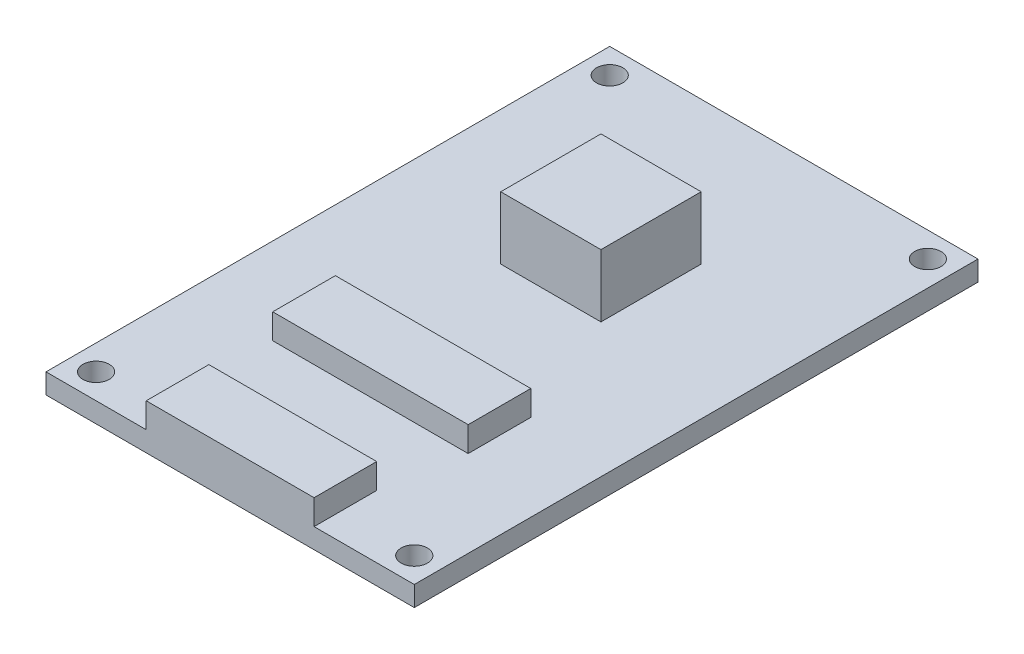
ISO-10303-21;
HEADER;
FILE_DESCRIPTION(('STEP AP214'),'2;1');
FILE_NAME('part.step','',(''),(''),'','','');
FILE_SCHEMA(('AUTOMOTIVE_DESIGN { 1 0 10303 214 1 1 1 1 }'));
ENDSEC;
DATA;
#1=APPLICATION_CONTEXT('core data for automotive mechanical design processes');
#2=APPLICATION_PROTOCOL_DEFINITION('international standard','automotive_design',2000,#1);
#3=PRODUCT_CONTEXT('',#1,'mechanical');
#4=PRODUCT('Part','Part','',(#3));
#5=PRODUCT_RELATED_PRODUCT_CATEGORY('part','',(#4));
#6=PRODUCT_DEFINITION_FORMATION('','',#4);
#7=PRODUCT_DEFINITION_CONTEXT('part definition',#1,'design');
#8=PRODUCT_DEFINITION('design','',#6,#7);
#9=PRODUCT_DEFINITION_SHAPE('','',#8);
#10=(LENGTH_UNIT() NAMED_UNIT(*) SI_UNIT(.MILLI.,.METRE.));
#11=(NAMED_UNIT(*) PLANE_ANGLE_UNIT() SI_UNIT($,.RADIAN.));
#12=(NAMED_UNIT(*) SI_UNIT($,.STERADIAN.) SOLID_ANGLE_UNIT());
#13=UNCERTAINTY_MEASURE_WITH_UNIT(LENGTH_MEASURE(1.E-05),#10,'distance_accuracy_value','');
#14=(GEOMETRIC_REPRESENTATION_CONTEXT(3) GLOBAL_UNCERTAINTY_ASSIGNED_CONTEXT((#13)) GLOBAL_UNIT_ASSIGNED_CONTEXT((#10,
#11,#12)) REPRESENTATION_CONTEXT('',''));
#15=CARTESIAN_POINT('',(0.,0.,0.));
#16=DIRECTION('',(0.,0.,1.));
#17=DIRECTION('',(1.,0.,0.));
#18=AXIS2_PLACEMENT_3D('',#15,#16,#17);
#19=CARTESIAN_POINT('',(0.,1.6,0.));
#20=DIRECTION('',(0.,-1.,0.));
#21=DIRECTION('',(0.,0.,-1.));
#22=AXIS2_PLACEMENT_3D('',#19,#20,#21);
#23=PLANE('',#22);
#24=DIRECTION('',(0.,0.,1.));
#25=VECTOR('',#24,1.);
#26=CARTESIAN_POINT('',(6.9,1.6,-11.2));
#27=LINE('',#26,#25);
#28=CARTESIAN_POINT('',(6.9,1.6,-16.2));
#29=VERTEX_POINT('',#28);
#30=CARTESIAN_POINT('',(6.9,1.6,-11.2));
#31=VERTEX_POINT('',#30);
#32=EDGE_CURVE('E248',#29,#31,#27,.T.);
#33=ORIENTED_EDGE('',*,*,#32,.F.);
#34=DIRECTION('',(-1.,0.,0.));
#35=VECTOR('',#34,1.);
#36=CARTESIAN_POINT('',(6.9,1.6,-16.2));
#37=LINE('',#36,#35);
#38=CARTESIAN_POINT('',(22.5,1.6,-16.2));
#39=VERTEX_POINT('',#38);
#40=EDGE_CURVE('E254',#39,#29,#37,.T.);
#41=ORIENTED_EDGE('',*,*,#40,.F.);
#42=DIRECTION('',(0.,0.,-1.));
#43=VECTOR('',#42,1.);
#44=CARTESIAN_POINT('',(22.5,1.6,-11.2));
#45=LINE('',#44,#43);
#46=CARTESIAN_POINT('',(22.5,1.6,-11.2));
#47=VERTEX_POINT('',#46);
#48=EDGE_CURVE('E271',#47,#39,#45,.T.);
#49=ORIENTED_EDGE('',*,*,#48,.F.);
#50=DIRECTION('',(1.,0.,0.));
#51=VECTOR('',#50,1.);
#52=CARTESIAN_POINT('',(6.9,1.6,-11.2));
#53=LINE('',#52,#51);
#54=EDGE_CURVE('E267',#31,#47,#53,.T.);
#55=ORIENTED_EDGE('',*,*,#54,.F.);
#56=EDGE_LOOP('',(#33,#41,#49,#55));
#57=FACE_BOUND('',#56,.T.);
#58=CARTESIAN_POINT('',(27.4,1.6,-2.));
#59=DIRECTION('',(0.,1.,0.));
#60=DIRECTION('',(0.,0.,1.));
#61=AXIS2_PLACEMENT_3D('',#58,#59,#60);
#62=CIRCLE('',#61,1.05);
#63=CARTESIAN_POINT('',(27.4,1.6,-0.950000000000006));
#64=VERTEX_POINT('',#63);
#65=EDGE_CURVE('E335',#64,#64,#62,.T.);
#66=ORIENTED_EDGE('',*,*,#65,.F.);
#67=EDGE_LOOP('',(#66));
#68=FACE_BOUND('',#67,.T.);
#69=CARTESIAN_POINT('',(2.00000000000001,1.6,-2.));
#70=DIRECTION('',(0.,1.,0.));
#71=DIRECTION('',(0.,0.,1.));
#72=AXIS2_PLACEMENT_3D('',#69,#70,#71);
#73=CIRCLE('',#72,1.05);
#74=CARTESIAN_POINT('',(2.00000000000001,1.6,-0.950000000000002));
#75=VERTEX_POINT('',#74);
#76=EDGE_CURVE('E343',#75,#75,#73,.T.);
#77=ORIENTED_EDGE('',*,*,#76,.F.);
#78=EDGE_LOOP('',(#77));
#79=FACE_BOUND('',#78,.T.);
#80=CARTESIAN_POINT('',(27.4,1.6,-43.));
#81=DIRECTION('',(0.,1.,0.));
#82=DIRECTION('',(0.,0.,1.));
#83=AXIS2_PLACEMENT_3D('',#80,#81,#82);
#84=CIRCLE('',#83,1.05);
#85=CARTESIAN_POINT('',(27.4,1.6,-41.95));
#86=VERTEX_POINT('',#85);
#87=EDGE_CURVE('E351',#86,#86,#84,.T.);
#88=ORIENTED_EDGE('',*,*,#87,.F.);
#89=EDGE_LOOP('',(#88));
#90=FACE_BOUND('',#89,.T.);
#91=CARTESIAN_POINT('',(2.,1.6,-43.));
#92=DIRECTION('',(0.,1.,0.));
#93=DIRECTION('',(0.,0.,1.));
#94=AXIS2_PLACEMENT_3D('',#91,#92,#93);
#95=CIRCLE('',#94,1.05);
#96=CARTESIAN_POINT('',(2.,1.6,-41.95));
#97=VERTEX_POINT('',#96);
#98=EDGE_CURVE('E359',#97,#97,#95,.T.);
#99=ORIENTED_EDGE('',*,*,#98,.F.);
#100=EDGE_LOOP('',(#99));
#101=FACE_BOUND('',#100,.T.);
#102=DIRECTION('',(0.,0.,1.));
#103=VECTOR('',#102,1.);
#104=CARTESIAN_POINT('',(8.,1.6,0.));
#105=LINE('',#104,#103);
#106=CARTESIAN_POINT('',(8.,1.6,-5.));
#107=VERTEX_POINT('',#106);
#108=CARTESIAN_POINT('',(8.,1.6,0.));
#109=VERTEX_POINT('',#108);
#110=EDGE_CURVE('E293',#107,#109,#105,.T.);
#111=ORIENTED_EDGE('',*,*,#110,.F.);
#112=DIRECTION('',(-1.,0.,0.));
#113=VECTOR('',#112,1.);
#114=CARTESIAN_POINT('',(8.,1.6,-5.));
#115=LINE('',#114,#113);
#116=CARTESIAN_POINT('',(21.4,1.6,-5.));
#117=VERTEX_POINT('',#116);
#118=EDGE_CURVE('E299',#117,#107,#115,.T.);
#119=ORIENTED_EDGE('',*,*,#118,.F.);
#120=DIRECTION('',(0.,0.,-1.));
#121=VECTOR('',#120,1.);
#122=CARTESIAN_POINT('',(21.4,1.6,0.));
#123=LINE('',#122,#121);
#124=CARTESIAN_POINT('',(21.4,1.6,0.));
#125=VERTEX_POINT('',#124);
#126=EDGE_CURVE('E312',#125,#117,#123,.T.);
#127=ORIENTED_EDGE('',*,*,#126,.F.);
#128=DIRECTION('',(1.,0.,0.));
#129=VECTOR('',#128,1.);
#130=CARTESIAN_POINT('',(0.,1.6,0.));
#131=LINE('',#130,#129);
#132=CARTESIAN_POINT('',(29.4,1.6,0.));
#133=VERTEX_POINT('',#132);
#134=EDGE_CURVE('E371',#125,#133,#131,.T.);
#135=ORIENTED_EDGE('',*,*,#134,.T.);
#136=DIRECTION('',(0.,0.,-1.));
#137=VECTOR('',#136,1.);
#138=CARTESIAN_POINT('',(29.4,1.6,0.));
#139=LINE('',#138,#137);
#140=CARTESIAN_POINT('',(29.4,1.6,-45.));
#141=VERTEX_POINT('',#140);
#142=EDGE_CURVE('E376',#133,#141,#139,.T.);
#143=ORIENTED_EDGE('',*,*,#142,.T.);
#144=DIRECTION('',(-1.,0.,0.));
#145=VECTOR('',#144,1.);
#146=CARTESIAN_POINT('',(0.,1.6,-45.));
#147=LINE('',#146,#145);
#148=CARTESIAN_POINT('',(0.,1.6,-45.));
#149=VERTEX_POINT('',#148);
#150=EDGE_CURVE('E379',#141,#149,#147,.T.);
#151=ORIENTED_EDGE('',*,*,#150,.T.);
#152=DIRECTION('',(0.,0.,1.));
#153=VECTOR('',#152,1.);
#154=CARTESIAN_POINT('',(0.,1.6,0.));
#155=LINE('',#154,#153);
#156=CARTESIAN_POINT('',(0.,1.6,0.));
#157=VERTEX_POINT('',#156);
#158=EDGE_CURVE('E367',#149,#157,#155,.T.);
#159=ORIENTED_EDGE('',*,*,#158,.T.);
#160=EDGE_CURVE('E373',#157,#109,#131,.T.);
#161=ORIENTED_EDGE('',*,*,#160,.T.);
#162=EDGE_LOOP('',(#111,#119,#127,#135,#143,#151,#159,#161));
#163=FACE_BOUND('',#162,.T.);
#164=DIRECTION('',(0.,0.,1.));
#165=VECTOR('',#164,1.);
#166=CARTESIAN_POINT('',(10.7,1.6,-33.6));
#167=LINE('',#166,#165);
#168=CARTESIAN_POINT('',(10.7,1.6,-33.6));
#169=VERTEX_POINT('',#168);
#170=CARTESIAN_POINT('',(10.7,1.6,-25.6));
#171=VERTEX_POINT('',#170);
#172=EDGE_CURVE('E199',#169,#171,#167,.T.);
#173=ORIENTED_EDGE('',*,*,#172,.F.);
#174=DIRECTION('',(-1.,0.,0.));
#175=VECTOR('',#174,1.);
#176=CARTESIAN_POINT('',(10.7,1.6,-33.6));
#177=LINE('',#176,#175);
#178=CARTESIAN_POINT('',(18.7,1.6,-33.6));
#179=VERTEX_POINT('',#178);
#180=EDGE_CURVE('E196',#179,#169,#177,.T.);
#181=ORIENTED_EDGE('',*,*,#180,.F.);
#182=DIRECTION('',(0.,0.,-1.));
#183=VECTOR('',#182,1.);
#184=CARTESIAN_POINT('',(18.7,1.6,-33.6));
#185=LINE('',#184,#183);
#186=CARTESIAN_POINT('',(18.7,1.6,-25.6));
#187=VERTEX_POINT('',#186);
#188=EDGE_CURVE('E60',#187,#179,#185,.T.);
#189=ORIENTED_EDGE('',*,*,#188,.F.);
#190=DIRECTION('',(1.,0.,0.));
#191=VECTOR('',#190,1.);
#192=CARTESIAN_POINT('',(10.7,1.6,-25.6));
#193=LINE('',#192,#191);
#194=EDGE_CURVE('E55',#171,#187,#193,.T.);
#195=ORIENTED_EDGE('',*,*,#194,.F.);
#196=EDGE_LOOP('',(#173,#181,#189,#195));
#197=FACE_BOUND('',#196,.T.);
#198=ADVANCED_FACE('F39',(#57,#68,#79,#90,#101,#163,#197),#23,.F.);
#199=CARTESIAN_POINT('',(0.,0.,0.));
#200=DIRECTION('',(0.,-1.,0.));
#201=DIRECTION('',(0.,0.,-1.));
#202=AXIS2_PLACEMENT_3D('',#199,#200,#201);
#203=PLANE('',#202);
#204=CARTESIAN_POINT('',(2.00000000000001,0.,-2.));
#205=DIRECTION('',(0.,1.,0.));
#206=DIRECTION('',(0.,0.,1.));
#207=AXIS2_PLACEMENT_3D('',#204,#205,#206);
#208=CIRCLE('',#207,1.05);
#209=CARTESIAN_POINT('',(2.00000000000001,0.,-0.950000000000002));
#210=VERTEX_POINT('',#209);
#211=EDGE_CURVE('E339',#210,#210,#208,.T.);
#212=ORIENTED_EDGE('',*,*,#211,.T.);
#213=EDGE_LOOP('',(#212));
#214=FACE_BOUND('',#213,.T.);
#215=CARTESIAN_POINT('',(2.,0.,-43.));
#216=DIRECTION('',(0.,1.,0.));
#217=DIRECTION('',(0.,0.,1.));
#218=AXIS2_PLACEMENT_3D('',#215,#216,#217);
#219=CIRCLE('',#218,1.05);
#220=CARTESIAN_POINT('',(2.,0.,-41.95));
#221=VERTEX_POINT('',#220);
#222=EDGE_CURVE('E355',#221,#221,#219,.T.);
#223=ORIENTED_EDGE('',*,*,#222,.T.);
#224=EDGE_LOOP('',(#223));
#225=FACE_BOUND('',#224,.T.);
#226=DIRECTION('',(0.,0.,1.));
#227=VECTOR('',#226,1.);
#228=CARTESIAN_POINT('',(0.,0.,0.));
#229=LINE('',#228,#227);
#230=CARTESIAN_POINT('',(0.,0.,-45.));
#231=VERTEX_POINT('',#230);
#232=CARTESIAN_POINT('',(0.,0.,0.));
#233=VERTEX_POINT('',#232);
#234=EDGE_CURVE('E363',#231,#233,#229,.T.);
#235=ORIENTED_EDGE('',*,*,#234,.F.);
#236=DIRECTION('',(-1.,0.,0.));
#237=VECTOR('',#236,1.);
#238=CARTESIAN_POINT('',(0.,0.,-45.));
#239=LINE('',#238,#237);
#240=CARTESIAN_POINT('',(29.4,0.,-45.));
#241=VERTEX_POINT('',#240);
#242=EDGE_CURVE('E372',#241,#231,#239,.T.);
#243=ORIENTED_EDGE('',*,*,#242,.F.);
#244=DIRECTION('',(0.,0.,-1.));
#245=VECTOR('',#244,1.);
#246=CARTESIAN_POINT('',(29.4,0.,0.));
#247=LINE('',#246,#245);
#248=CARTESIAN_POINT('',(29.4,0.,0.));
#249=VERTEX_POINT('',#248);
#250=EDGE_CURVE('E389',#249,#241,#247,.T.);
#251=ORIENTED_EDGE('',*,*,#250,.F.);
#252=DIRECTION('',(1.,0.,0.));
#253=VECTOR('',#252,1.);
#254=CARTESIAN_POINT('',(0.,0.,0.));
#255=LINE('',#254,#253);
#256=EDGE_CURVE('E386',#233,#249,#255,.T.);
#257=ORIENTED_EDGE('',*,*,#256,.F.);
#258=EDGE_LOOP('',(#235,#243,#251,#257));
#259=FACE_BOUND('',#258,.T.);
#260=CARTESIAN_POINT('',(27.4,0.,-43.));
#261=DIRECTION('',(0.,1.,0.));
#262=DIRECTION('',(0.,0.,1.));
#263=AXIS2_PLACEMENT_3D('',#260,#261,#262);
#264=CIRCLE('',#263,1.05);
#265=CARTESIAN_POINT('',(27.4,0.,-41.95));
#266=VERTEX_POINT('',#265);
#267=EDGE_CURVE('E347',#266,#266,#264,.T.);
#268=ORIENTED_EDGE('',*,*,#267,.T.);
#269=EDGE_LOOP('',(#268));
#270=FACE_BOUND('',#269,.T.);
#271=CARTESIAN_POINT('',(27.4,0.,-2.));
#272=DIRECTION('',(0.,1.,0.));
#273=DIRECTION('',(0.,0.,1.));
#274=AXIS2_PLACEMENT_3D('',#271,#272,#273);
#275=CIRCLE('',#274,1.05);
#276=CARTESIAN_POINT('',(27.4,0.,-0.950000000000006));
#277=VERTEX_POINT('',#276);
#278=EDGE_CURVE('E334',#277,#277,#275,.T.);
#279=ORIENTED_EDGE('',*,*,#278,.T.);
#280=EDGE_LOOP('',(#279));
#281=FACE_BOUND('',#280,.T.);
#282=DIRECTION('',(1.,0.,0.));
#283=VECTOR('',#282,1.);
#284=CARTESIAN_POINT('',(7.4,0.,-6.3));
#285=LINE('',#284,#283);
#286=CARTESIAN_POINT('',(7.4,0.,-6.3));
#287=VERTEX_POINT('',#286);
#288=CARTESIAN_POINT('',(22.1,0.,-6.3));
#289=VERTEX_POINT('',#288);
#290=EDGE_CURVE('E206',#287,#289,#285,.T.);
#291=ORIENTED_EDGE('',*,*,#290,.F.);
#292=DIRECTION('',(0.,0.,-1.));
#293=VECTOR('',#292,1.);
#294=CARTESIAN_POINT('',(7.4,0.,-2.3));
#295=LINE('',#294,#293);
#296=CARTESIAN_POINT('',(7.4,0.,-2.3));
#297=VERTEX_POINT('',#296);
#298=EDGE_CURVE('E201',#297,#287,#295,.T.);
#299=ORIENTED_EDGE('',*,*,#298,.F.);
#300=DIRECTION('',(-1.,0.,0.));
#301=VECTOR('',#300,1.);
#302=CARTESIAN_POINT('',(7.4,0.,-2.3));
#303=LINE('',#302,#301);
#304=CARTESIAN_POINT('',(22.1,0.,-2.3));
#305=VERTEX_POINT('',#304);
#306=EDGE_CURVE('E217',#305,#297,#303,.T.);
#307=ORIENTED_EDGE('',*,*,#306,.F.);
#308=DIRECTION('',(0.,0.,1.));
#309=VECTOR('',#308,1.);
#310=CARTESIAN_POINT('',(22.1,0.,-2.3));
#311=LINE('',#310,#309);
#312=EDGE_CURVE('E229',#289,#305,#311,.T.);
#313=ORIENTED_EDGE('',*,*,#312,.F.);
#314=EDGE_LOOP('',(#291,#299,#307,#313));
#315=FACE_BOUND('',#314,.T.);
#316=ADVANCED_FACE('F413',(#214,#225,#259,#270,#281,#315),#203,.T.);
#317=CARTESIAN_POINT('',(0.,1.6,0.));
#318=DIRECTION('',(1.,0.,0.));
#319=DIRECTION('',(0.,0.,-1.));
#320=AXIS2_PLACEMENT_3D('',#317,#318,#319);
#321=PLANE('',#320);
#322=ORIENTED_EDGE('',*,*,#234,.T.);
#323=DIRECTION('',(0.,-1.,0.));
#324=VECTOR('',#323,1.);
#325=CARTESIAN_POINT('',(0.,1.6,0.));
#326=LINE('',#325,#324);
#327=EDGE_CURVE('E11',#157,#233,#326,.T.);
#328=ORIENTED_EDGE('',*,*,#327,.F.);
#329=ORIENTED_EDGE('',*,*,#158,.F.);
#330=DIRECTION('',(0.,-1.,0.));
#331=VECTOR('',#330,1.);
#332=CARTESIAN_POINT('',(0.,1.6,-45.));
#333=LINE('',#332,#331);
#334=EDGE_CURVE('E382',#149,#231,#333,.T.);
#335=ORIENTED_EDGE('',*,*,#334,.T.);
#336=EDGE_LOOP('',(#322,#328,#329,#335));
#337=FACE_BOUND('',#336,.T.);
#338=ADVANCED_FACE('F41',(#337),#321,.F.);
#339=CARTESIAN_POINT('',(0.,1.6,0.));
#340=DIRECTION('',(0.,0.,-1.));
#341=DIRECTION('',(-1.,0.,0.));
#342=AXIS2_PLACEMENT_3D('',#339,#340,#341);
#343=PLANE('',#342);
#344=ORIENTED_EDGE('',*,*,#256,.T.);
#345=DIRECTION('',(0.,-1.,0.));
#346=VECTOR('',#345,1.);
#347=CARTESIAN_POINT('',(29.4,1.6,0.));
#348=LINE('',#347,#346);
#349=EDGE_CURVE('E48',#133,#249,#348,.T.);
#350=ORIENTED_EDGE('',*,*,#349,.F.);
#351=ORIENTED_EDGE('',*,*,#134,.F.);
#352=DIRECTION('',(0.,-1.,0.));
#353=VECTOR('',#352,1.);
#354=CARTESIAN_POINT('',(21.4,3.6,0.));
#355=LINE('',#354,#353);
#356=CARTESIAN_POINT('',(21.4,3.6,0.));
#357=VERTEX_POINT('',#356);
#358=EDGE_CURVE('E326',#357,#125,#355,.T.);
#359=ORIENTED_EDGE('',*,*,#358,.F.);
#360=DIRECTION('',(1.,0.,0.));
#361=VECTOR('',#360,1.);
#362=CARTESIAN_POINT('',(8.,3.6,0.));
#363=LINE('',#362,#361);
#364=CARTESIAN_POINT('',(8.,3.6,0.));
#365=VERTEX_POINT('',#364);
#366=EDGE_CURVE('E298',#365,#357,#363,.T.);
#367=ORIENTED_EDGE('',*,*,#366,.F.);
#368=DIRECTION('',(0.,-1.,0.));
#369=VECTOR('',#368,1.);
#370=CARTESIAN_POINT('',(8.,3.6,0.));
#371=LINE('',#370,#369);
#372=EDGE_CURVE('E330',#365,#109,#371,.T.);
#373=ORIENTED_EDGE('',*,*,#372,.T.);
#374=ORIENTED_EDGE('',*,*,#160,.F.);
#375=ORIENTED_EDGE('',*,*,#327,.T.);
#376=EDGE_LOOP('',(#344,#350,#351,#359,#367,#373,#374,#375));
#377=FACE_BOUND('',#376,.T.);
#378=ADVANCED_FACE('F425',(#377),#343,.F.);
#379=CARTESIAN_POINT('',(29.4,1.6,0.));
#380=DIRECTION('',(-1.,0.,0.));
#381=DIRECTION('',(0.,0.,1.));
#382=AXIS2_PLACEMENT_3D('',#379,#380,#381);
#383=PLANE('',#382);
#384=ORIENTED_EDGE('',*,*,#250,.T.);
#385=DIRECTION('',(0.,-1.,0.));
#386=VECTOR('',#385,1.);
#387=CARTESIAN_POINT('',(29.4,1.6,-45.));
#388=LINE('',#387,#386);
#389=EDGE_CURVE('E397',#141,#241,#388,.T.);
#390=ORIENTED_EDGE('',*,*,#389,.F.);
#391=ORIENTED_EDGE('',*,*,#142,.F.);
#392=ORIENTED_EDGE('',*,*,#349,.T.);
#393=EDGE_LOOP('',(#384,#390,#391,#392));
#394=FACE_BOUND('',#393,.T.);
#395=ADVANCED_FACE('F406',(#394),#383,.F.);
#396=CARTESIAN_POINT('',(0.,1.6,-45.));
#397=DIRECTION('',(0.,0.,1.));
#398=DIRECTION('',(1.,0.,0.));
#399=AXIS2_PLACEMENT_3D('',#396,#397,#398);
#400=PLANE('',#399);
#401=ORIENTED_EDGE('',*,*,#242,.T.);
#402=ORIENTED_EDGE('',*,*,#334,.F.);
#403=ORIENTED_EDGE('',*,*,#150,.F.);
#404=ORIENTED_EDGE('',*,*,#389,.T.);
#405=EDGE_LOOP('',(#401,#402,#403,#404));
#406=FACE_BOUND('',#405,.T.);
#407=ADVANCED_FACE('F417',(#406),#400,.F.);
#408=CARTESIAN_POINT('',(2.,1.6,-43.));
#409=DIRECTION('',(0.,-1.,0.));
#410=DIRECTION('',(0.,0.,-1.));
#411=AXIS2_PLACEMENT_3D('',#408,#409,#410);
#412=CYLINDRICAL_SURFACE('',#411,1.05);
#413=ORIENTED_EDGE('',*,*,#98,.T.);
#414=EDGE_LOOP('',(#413));
#415=FACE_BOUND('',#414,.T.);
#416=ORIENTED_EDGE('',*,*,#222,.F.);
#417=EDGE_LOOP('',(#416));
#418=FACE_BOUND('',#417,.T.);
#419=ADVANCED_FACE('F459',(#415,#418),#412,.F.);
#420=CARTESIAN_POINT('',(27.4,1.6,-43.));
#421=DIRECTION('',(0.,-1.,0.));
#422=DIRECTION('',(0.,0.,-1.));
#423=AXIS2_PLACEMENT_3D('',#420,#421,#422);
#424=CYLINDRICAL_SURFACE('',#423,1.05);
#425=ORIENTED_EDGE('',*,*,#87,.T.);
#426=EDGE_LOOP('',(#425));
#427=FACE_BOUND('',#426,.T.);
#428=ORIENTED_EDGE('',*,*,#267,.F.);
#429=EDGE_LOOP('',(#428));
#430=FACE_BOUND('',#429,.T.);
#431=ADVANCED_FACE('F680',(#427,#430),#424,.F.);
#432=CARTESIAN_POINT('',(2.00000000000001,1.6,-2.));
#433=DIRECTION('',(0.,-1.,0.));
#434=DIRECTION('',(0.,0.,-1.));
#435=AXIS2_PLACEMENT_3D('',#432,#433,#434);
#436=CYLINDRICAL_SURFACE('',#435,1.05);
#437=ORIENTED_EDGE('',*,*,#76,.T.);
#438=EDGE_LOOP('',(#437));
#439=FACE_BOUND('',#438,.T.);
#440=ORIENTED_EDGE('',*,*,#211,.F.);
#441=EDGE_LOOP('',(#440));
#442=FACE_BOUND('',#441,.T.);
#443=ADVANCED_FACE('F671',(#439,#442),#436,.F.);
#444=CARTESIAN_POINT('',(27.4,1.6,-2.));
#445=DIRECTION('',(0.,-1.,0.));
#446=DIRECTION('',(0.,0.,-1.));
#447=AXIS2_PLACEMENT_3D('',#444,#445,#446);
#448=CYLINDRICAL_SURFACE('',#447,1.05);
#449=ORIENTED_EDGE('',*,*,#65,.T.);
#450=EDGE_LOOP('',(#449));
#451=FACE_BOUND('',#450,.T.);
#452=ORIENTED_EDGE('',*,*,#278,.F.);
#453=EDGE_LOOP('',(#452));
#454=FACE_BOUND('',#453,.T.);
#455=ADVANCED_FACE('F655',(#451,#454),#448,.F.);
#456=CARTESIAN_POINT('',(8.,3.6,0.));
#457=DIRECTION('',(1.,0.,0.));
#458=DIRECTION('',(0.,0.,-1.));
#459=AXIS2_PLACEMENT_3D('',#456,#457,#458);
#460=PLANE('',#459);
#461=ORIENTED_EDGE('',*,*,#110,.T.);
#462=ORIENTED_EDGE('',*,*,#372,.F.);
#463=DIRECTION('',(0.,0.,1.));
#464=VECTOR('',#463,1.);
#465=CARTESIAN_POINT('',(8.,3.6,0.));
#466=LINE('',#465,#464);
#467=CARTESIAN_POINT('',(8.,3.6,-5.));
#468=VERTEX_POINT('',#467);
#469=EDGE_CURVE('E294',#468,#365,#466,.T.);
#470=ORIENTED_EDGE('',*,*,#469,.F.);
#471=DIRECTION('',(0.,-1.,0.));
#472=VECTOR('',#471,1.);
#473=CARTESIAN_POINT('',(8.,3.6,-5.));
#474=LINE('',#473,#472);
#475=EDGE_CURVE('E308',#468,#107,#474,.T.);
#476=ORIENTED_EDGE('',*,*,#475,.T.);
#477=EDGE_LOOP('',(#461,#462,#470,#476));
#478=FACE_BOUND('',#477,.T.);
#479=ADVANCED_FACE('F437',(#478),#460,.F.);
#480=CARTESIAN_POINT('',(21.4,3.6,0.));
#481=DIRECTION('',(-1.,0.,0.));
#482=DIRECTION('',(0.,0.,1.));
#483=AXIS2_PLACEMENT_3D('',#480,#481,#482);
#484=PLANE('',#483);
#485=ORIENTED_EDGE('',*,*,#126,.T.);
#486=DIRECTION('',(0.,-1.,0.));
#487=VECTOR('',#486,1.);
#488=CARTESIAN_POINT('',(21.4,3.6,-5.));
#489=LINE('',#488,#487);
#490=CARTESIAN_POINT('',(21.4,3.6,-5.));
#491=VERTEX_POINT('',#490);
#492=EDGE_CURVE('E322',#491,#117,#489,.T.);
#493=ORIENTED_EDGE('',*,*,#492,.F.);
#494=DIRECTION('',(0.,0.,-1.));
#495=VECTOR('',#494,1.);
#496=CARTESIAN_POINT('',(21.4,3.6,0.));
#497=LINE('',#496,#495);
#498=EDGE_CURVE('E302',#357,#491,#497,.T.);
#499=ORIENTED_EDGE('',*,*,#498,.F.);
#500=ORIENTED_EDGE('',*,*,#358,.T.);
#501=EDGE_LOOP('',(#485,#493,#499,#500));
#502=FACE_BOUND('',#501,.T.);
#503=ADVANCED_FACE('F428',(#502),#484,.F.);
#504=CARTESIAN_POINT('',(8.,3.6,-5.));
#505=DIRECTION('',(0.,0.,1.));
#506=DIRECTION('',(1.,0.,0.));
#507=AXIS2_PLACEMENT_3D('',#504,#505,#506);
#508=PLANE('',#507);
#509=ORIENTED_EDGE('',*,*,#118,.T.);
#510=ORIENTED_EDGE('',*,*,#475,.F.);
#511=DIRECTION('',(-1.,0.,0.));
#512=VECTOR('',#511,1.);
#513=CARTESIAN_POINT('',(8.,3.6,-5.));
#514=LINE('',#513,#512);
#515=EDGE_CURVE('E305',#491,#468,#514,.T.);
#516=ORIENTED_EDGE('',*,*,#515,.F.);
#517=ORIENTED_EDGE('',*,*,#492,.T.);
#518=EDGE_LOOP('',(#509,#510,#516,#517));
#519=FACE_BOUND('',#518,.T.);
#520=ADVANCED_FACE('F439',(#519),#508,.F.);
#521=CARTESIAN_POINT('',(0.,3.6,0.));
#522=DIRECTION('',(0.,-1.,0.));
#523=DIRECTION('',(0.,0.,-1.));
#524=AXIS2_PLACEMENT_3D('',#521,#522,#523);
#525=PLANE('',#524);
#526=ORIENTED_EDGE('',*,*,#469,.T.);
#527=ORIENTED_EDGE('',*,*,#366,.T.);
#528=ORIENTED_EDGE('',*,*,#498,.T.);
#529=ORIENTED_EDGE('',*,*,#515,.T.);
#530=EDGE_LOOP('',(#526,#527,#528,#529));
#531=FACE_BOUND('',#530,.T.);
#532=ADVANCED_FACE('F432',(#531),#525,.F.);
#533=CARTESIAN_POINT('',(6.9,3.6,-11.2));
#534=DIRECTION('',(1.,0.,0.));
#535=DIRECTION('',(0.,0.,-1.));
#536=AXIS2_PLACEMENT_3D('',#533,#534,#535);
#537=PLANE('',#536);
#538=ORIENTED_EDGE('',*,*,#32,.T.);
#539=DIRECTION('',(0.,-1.,0.));
#540=VECTOR('',#539,1.);
#541=CARTESIAN_POINT('',(6.9,3.6,-11.2));
#542=LINE('',#541,#540);
#543=CARTESIAN_POINT('',(6.9,3.6,-11.2));
#544=VERTEX_POINT('',#543);
#545=EDGE_CURVE('E289',#544,#31,#542,.T.);
#546=ORIENTED_EDGE('',*,*,#545,.F.);
#547=DIRECTION('',(0.,0.,1.));
#548=VECTOR('',#547,1.);
#549=CARTESIAN_POINT('',(6.9,3.6,-11.2));
#550=LINE('',#549,#548);
#551=CARTESIAN_POINT('',(6.9,3.6,-16.2));
#552=VERTEX_POINT('',#551);
#553=EDGE_CURVE('E249',#552,#544,#550,.T.);
#554=ORIENTED_EDGE('',*,*,#553,.F.);
#555=DIRECTION('',(0.,-1.,0.));
#556=VECTOR('',#555,1.);
#557=CARTESIAN_POINT('',(6.9,3.6,-16.2));
#558=LINE('',#557,#556);
#559=EDGE_CURVE('E263',#552,#29,#558,.T.);
#560=ORIENTED_EDGE('',*,*,#559,.T.);
#561=EDGE_LOOP('',(#538,#546,#554,#560));
#562=FACE_BOUND('',#561,.T.);
#563=ADVANCED_FACE('F446',(#562),#537,.F.);
#564=CARTESIAN_POINT('',(6.9,3.6,-11.2));
#565=DIRECTION('',(0.,0.,-1.));
#566=DIRECTION('',(-1.,0.,0.));
#567=AXIS2_PLACEMENT_3D('',#564,#565,#566);
#568=PLANE('',#567);
#569=ORIENTED_EDGE('',*,*,#54,.T.);
#570=DIRECTION('',(0.,-1.,0.));
#571=VECTOR('',#570,1.);
#572=CARTESIAN_POINT('',(22.5,3.6,-11.2));
#573=LINE('',#572,#571);
#574=CARTESIAN_POINT('',(22.5,3.6,-11.2));
#575=VERTEX_POINT('',#574);
#576=EDGE_CURVE('E285',#575,#47,#573,.T.);
#577=ORIENTED_EDGE('',*,*,#576,.F.);
#578=DIRECTION('',(1.,0.,0.));
#579=VECTOR('',#578,1.);
#580=CARTESIAN_POINT('',(6.9,3.6,-11.2));
#581=LINE('',#580,#579);
#582=EDGE_CURVE('E253',#544,#575,#581,.T.);
#583=ORIENTED_EDGE('',*,*,#582,.F.);
#584=ORIENTED_EDGE('',*,*,#545,.T.);
#585=EDGE_LOOP('',(#569,#577,#583,#584));
#586=FACE_BOUND('',#585,.T.);
#587=ADVANCED_FACE('F594',(#586),#568,.F.);
#588=CARTESIAN_POINT('',(22.5,3.6,-11.2));
#589=DIRECTION('',(-1.,0.,0.));
#590=DIRECTION('',(0.,0.,1.));
#591=AXIS2_PLACEMENT_3D('',#588,#589,#590);
#592=PLANE('',#591);
#593=ORIENTED_EDGE('',*,*,#48,.T.);
#594=DIRECTION('',(0.,-1.,0.));
#595=VECTOR('',#594,1.);
#596=CARTESIAN_POINT('',(22.5,3.6,-16.2));
#597=LINE('',#596,#595);
#598=CARTESIAN_POINT('',(22.5,3.6,-16.2));
#599=VERTEX_POINT('',#598);
#600=EDGE_CURVE('E281',#599,#39,#597,.T.);
#601=ORIENTED_EDGE('',*,*,#600,.F.);
#602=DIRECTION('',(0.,0.,-1.));
#603=VECTOR('',#602,1.);
#604=CARTESIAN_POINT('',(22.5,3.6,-11.2));
#605=LINE('',#604,#603);
#606=EDGE_CURVE('E257',#575,#599,#605,.T.);
#607=ORIENTED_EDGE('',*,*,#606,.F.);
#608=ORIENTED_EDGE('',*,*,#576,.T.);
#609=EDGE_LOOP('',(#593,#601,#607,#608));
#610=FACE_BOUND('',#609,.T.);
#611=ADVANCED_FACE('F590',(#610),#592,.F.);
#612=CARTESIAN_POINT('',(6.9,3.6,-16.2));
#613=DIRECTION('',(0.,0.,1.));
#614=DIRECTION('',(1.,0.,0.));
#615=AXIS2_PLACEMENT_3D('',#612,#613,#614);
#616=PLANE('',#615);
#617=ORIENTED_EDGE('',*,*,#40,.T.);
#618=ORIENTED_EDGE('',*,*,#559,.F.);
#619=DIRECTION('',(-1.,0.,0.));
#620=VECTOR('',#619,1.);
#621=CARTESIAN_POINT('',(6.9,3.6,-16.2));
#622=LINE('',#621,#620);
#623=EDGE_CURVE('E260',#599,#552,#622,.T.);
#624=ORIENTED_EDGE('',*,*,#623,.F.);
#625=ORIENTED_EDGE('',*,*,#600,.T.);
#626=EDGE_LOOP('',(#617,#618,#624,#625));
#627=FACE_BOUND('',#626,.T.);
#628=ADVANCED_FACE('F586',(#627),#616,.F.);
#629=CARTESIAN_POINT('',(0.,3.6,0.));
#630=DIRECTION('',(0.,-1.,0.));
#631=DIRECTION('',(0.,0.,-1.));
#632=AXIS2_PLACEMENT_3D('',#629,#630,#631);
#633=PLANE('',#632);
#634=ORIENTED_EDGE('',*,*,#553,.T.);
#635=ORIENTED_EDGE('',*,*,#582,.T.);
#636=ORIENTED_EDGE('',*,*,#606,.T.);
#637=ORIENTED_EDGE('',*,*,#623,.T.);
#638=EDGE_LOOP('',(#634,#635,#636,#637));
#639=FACE_BOUND('',#638,.T.);
#640=ADVANCED_FACE('F484',(#639),#633,.F.);
#641=CARTESIAN_POINT('',(7.4,-2.,-2.3));
#642=DIRECTION('',(1.,0.,0.));
#643=DIRECTION('',(0.,0.,-1.));
#644=AXIS2_PLACEMENT_3D('',#641,#642,#643);
#645=PLANE('',#644);
#646=ORIENTED_EDGE('',*,*,#298,.T.);
#647=DIRECTION('',(0.,1.,0.));
#648=VECTOR('',#647,1.);
#649=CARTESIAN_POINT('',(7.4,-2.,-6.3));
#650=LINE('',#649,#648);
#651=CARTESIAN_POINT('',(7.4,-2.,-6.3));
#652=VERTEX_POINT('',#651);
#653=EDGE_CURVE('E245',#652,#287,#650,.T.);
#654=ORIENTED_EDGE('',*,*,#653,.F.);
#655=DIRECTION('',(0.,0.,-1.));
#656=VECTOR('',#655,1.);
#657=CARTESIAN_POINT('',(7.4,-2.,-2.3));
#658=LINE('',#657,#656);
#659=CARTESIAN_POINT('',(7.4,-2.,-2.3));
#660=VERTEX_POINT('',#659);
#661=EDGE_CURVE('E212',#660,#652,#658,.T.);
#662=ORIENTED_EDGE('',*,*,#661,.F.);
#663=DIRECTION('',(0.,1.,0.));
#664=VECTOR('',#663,1.);
#665=CARTESIAN_POINT('',(7.4,-2.,-2.3));
#666=LINE('',#665,#664);
#667=EDGE_CURVE('E225',#660,#297,#666,.T.);
#668=ORIENTED_EDGE('',*,*,#667,.T.);
#669=EDGE_LOOP('',(#646,#654,#662,#668));
#670=FACE_BOUND('',#669,.T.);
#671=ADVANCED_FACE('F488',(#670),#645,.F.);
#672=CARTESIAN_POINT('',(7.4,-2.,-6.3));
#673=DIRECTION('',(0.,0.,1.));
#674=DIRECTION('',(1.,0.,0.));
#675=AXIS2_PLACEMENT_3D('',#672,#673,#674);
#676=PLANE('',#675);
#677=ORIENTED_EDGE('',*,*,#290,.T.);
#678=DIRECTION('',(0.,1.,0.));
#679=VECTOR('',#678,1.);
#680=CARTESIAN_POINT('',(22.1,-2.,-6.3));
#681=LINE('',#680,#679);
#682=CARTESIAN_POINT('',(22.1,-2.,-6.3));
#683=VERTEX_POINT('',#682);
#684=EDGE_CURVE('E241',#683,#289,#681,.T.);
#685=ORIENTED_EDGE('',*,*,#684,.F.);
#686=DIRECTION('',(1.,0.,0.));
#687=VECTOR('',#686,1.);
#688=CARTESIAN_POINT('',(7.4,-2.,-6.3));
#689=LINE('',#688,#687);
#690=EDGE_CURVE('E216',#652,#683,#689,.T.);
#691=ORIENTED_EDGE('',*,*,#690,.F.);
#692=ORIENTED_EDGE('',*,*,#653,.T.);
#693=EDGE_LOOP('',(#677,#685,#691,#692));
#694=FACE_BOUND('',#693,.T.);
#695=ADVANCED_FACE('F492',(#694),#676,.F.);
#696=CARTESIAN_POINT('',(22.1,-2.,-2.3));
#697=DIRECTION('',(-1.,0.,0.));
#698=DIRECTION('',(0.,0.,1.));
#699=AXIS2_PLACEMENT_3D('',#696,#697,#698);
#700=PLANE('',#699);
#701=ORIENTED_EDGE('',*,*,#312,.T.);
#702=DIRECTION('',(0.,1.,0.));
#703=VECTOR('',#702,1.);
#704=CARTESIAN_POINT('',(22.1,-2.,-2.3));
#705=LINE('',#704,#703);
#706=CARTESIAN_POINT('',(22.1,-2.,-2.3));
#707=VERTEX_POINT('',#706);
#708=EDGE_CURVE('E238',#707,#305,#705,.T.);
#709=ORIENTED_EDGE('',*,*,#708,.F.);
#710=DIRECTION('',(0.,0.,1.));
#711=VECTOR('',#710,1.);
#712=CARTESIAN_POINT('',(22.1,-2.,-2.3));
#713=LINE('',#712,#711);
#714=EDGE_CURVE('E220',#683,#707,#713,.T.);
#715=ORIENTED_EDGE('',*,*,#714,.F.);
#716=ORIENTED_EDGE('',*,*,#684,.T.);
#717=EDGE_LOOP('',(#701,#709,#715,#716));
#718=FACE_BOUND('',#717,.T.);
#719=ADVANCED_FACE('F502',(#718),#700,.F.);
#720=CARTESIAN_POINT('',(7.4,-2.,-2.3));
#721=DIRECTION('',(0.,0.,-1.));
#722=DIRECTION('',(-1.,0.,0.));
#723=AXIS2_PLACEMENT_3D('',#720,#721,#722);
#724=PLANE('',#723);
#725=ORIENTED_EDGE('',*,*,#306,.T.);
#726=ORIENTED_EDGE('',*,*,#667,.F.);
#727=DIRECTION('',(-1.,0.,0.));
#728=VECTOR('',#727,1.);
#729=CARTESIAN_POINT('',(7.4,-2.,-2.3));
#730=LINE('',#729,#728);
#731=EDGE_CURVE('E223',#707,#660,#730,.T.);
#732=ORIENTED_EDGE('',*,*,#731,.F.);
#733=ORIENTED_EDGE('',*,*,#708,.T.);
#734=EDGE_LOOP('',(#725,#726,#732,#733));
#735=FACE_BOUND('',#734,.T.);
#736=ADVANCED_FACE('F512',(#735),#724,.F.);
#737=CARTESIAN_POINT('',(0.,-2.,0.));
#738=DIRECTION('',(0.,-1.,0.));
#739=DIRECTION('',(0.,0.,-1.));
#740=AXIS2_PLACEMENT_3D('',#737,#738,#739);
#741=PLANE('',#740);
#742=ORIENTED_EDGE('',*,*,#661,.T.);
#743=ORIENTED_EDGE('',*,*,#690,.T.);
#744=ORIENTED_EDGE('',*,*,#714,.T.);
#745=ORIENTED_EDGE('',*,*,#731,.T.);
#746=EDGE_LOOP('',(#742,#743,#744,#745));
#747=FACE_BOUND('',#746,.T.);
#748=ADVANCED_FACE('F522',(#747),#741,.T.);
#749=CARTESIAN_POINT('',(10.7,6.6,-33.6));
#750=DIRECTION('',(1.,0.,0.));
#751=DIRECTION('',(0.,0.,-1.));
#752=AXIS2_PLACEMENT_3D('',#749,#750,#751);
#753=PLANE('',#752);
#754=ORIENTED_EDGE('',*,*,#172,.T.);
#755=DIRECTION('',(0.,-1.,0.));
#756=VECTOR('',#755,1.);
#757=CARTESIAN_POINT('',(10.7,6.6,-25.6));
#758=LINE('',#757,#756);
#759=CARTESIAN_POINT('',(10.7,6.6,-25.6));
#760=VERTEX_POINT('',#759);
#761=EDGE_CURVE('E178',#760,#171,#758,.T.);
#762=ORIENTED_EDGE('',*,*,#761,.F.);
#763=DIRECTION('',(0.,0.,1.));
#764=VECTOR('',#763,1.);
#765=CARTESIAN_POINT('',(10.7,6.6,-33.6));
#766=LINE('',#765,#764);
#767=CARTESIAN_POINT('',(10.7,6.6,-33.6));
#768=VERTEX_POINT('',#767);
#769=EDGE_CURVE('E186',#768,#760,#766,.T.);
#770=ORIENTED_EDGE('',*,*,#769,.F.);
#771=DIRECTION('',(0.,-1.,0.));
#772=VECTOR('',#771,1.);
#773=CARTESIAN_POINT('',(10.7,6.6,-33.6));
#774=LINE('',#773,#772);
#775=EDGE_CURVE('E746',#768,#169,#774,.T.);
#776=ORIENTED_EDGE('',*,*,#775,.T.);
#777=EDGE_LOOP('',(#754,#762,#770,#776));
#778=FACE_BOUND('',#777,.T.);
#779=ADVANCED_FACE('F198',(#778),#753,.F.);
#780=CARTESIAN_POINT('',(10.7,6.6,-25.6));
#781=DIRECTION('',(0.,0.,-1.));
#782=DIRECTION('',(-1.,0.,0.));
#783=AXIS2_PLACEMENT_3D('',#780,#781,#782);
#784=PLANE('',#783);
#785=ORIENTED_EDGE('',*,*,#194,.T.);
#786=DIRECTION('',(0.,-1.,0.));
#787=VECTOR('',#786,1.);
#788=CARTESIAN_POINT('',(18.7,6.6,-25.6));
#789=LINE('',#788,#787);
#790=CARTESIAN_POINT('',(18.7,6.6,-25.6));
#791=VERTEX_POINT('',#790);
#792=EDGE_CURVE('E181',#791,#187,#789,.T.);
#793=ORIENTED_EDGE('',*,*,#792,.F.);
#794=DIRECTION('',(1.,0.,0.));
#795=VECTOR('',#794,1.);
#796=CARTESIAN_POINT('',(10.7,6.6,-25.6));
#797=LINE('',#796,#795);
#798=EDGE_CURVE('E174',#760,#791,#797,.T.);
#799=ORIENTED_EDGE('',*,*,#798,.F.);
#800=ORIENTED_EDGE('',*,*,#761,.T.);
#801=EDGE_LOOP('',(#785,#793,#799,#800));
#802=FACE_BOUND('',#801,.T.);
#803=ADVANCED_FACE('F176',(#802),#784,.F.);
#804=CARTESIAN_POINT('',(18.7,6.6,-33.6));
#805=DIRECTION('',(-1.,0.,0.));
#806=DIRECTION('',(0.,0.,1.));
#807=AXIS2_PLACEMENT_3D('',#804,#805,#806);
#808=PLANE('',#807);
#809=ORIENTED_EDGE('',*,*,#188,.T.);
#810=DIRECTION('',(0.,-1.,0.));
#811=VECTOR('',#810,1.);
#812=CARTESIAN_POINT('',(18.7,6.6,-33.6));
#813=LINE('',#812,#811);
#814=CARTESIAN_POINT('',(18.7,6.6,-33.6));
#815=VERTEX_POINT('',#814);
#816=EDGE_CURVE('E208',#815,#179,#813,.T.);
#817=ORIENTED_EDGE('',*,*,#816,.F.);
#818=DIRECTION('',(0.,0.,-1.));
#819=VECTOR('',#818,1.);
#820=CARTESIAN_POINT('',(18.7,6.6,-33.6));
#821=LINE('',#820,#819);
#822=EDGE_CURVE('E185',#791,#815,#821,.T.);
#823=ORIENTED_EDGE('',*,*,#822,.F.);
#824=ORIENTED_EDGE('',*,*,#792,.T.);
#825=EDGE_LOOP('',(#809,#817,#823,#824));
#826=FACE_BOUND('',#825,.T.);
#827=ADVANCED_FACE('F553',(#826),#808,.F.);
#828=CARTESIAN_POINT('',(10.7,6.6,-33.6));
#829=DIRECTION('',(0.,0.,1.));
#830=DIRECTION('',(1.,0.,0.));
#831=AXIS2_PLACEMENT_3D('',#828,#829,#830);
#832=PLANE('',#831);
#833=ORIENTED_EDGE('',*,*,#180,.T.);
#834=ORIENTED_EDGE('',*,*,#775,.F.);
#835=DIRECTION('',(-1.,0.,0.));
#836=VECTOR('',#835,1.);
#837=CARTESIAN_POINT('',(10.7,6.6,-33.6));
#838=LINE('',#837,#836);
#839=EDGE_CURVE('E191',#815,#768,#838,.T.);
#840=ORIENTED_EDGE('',*,*,#839,.F.);
#841=ORIENTED_EDGE('',*,*,#816,.T.);
#842=EDGE_LOOP('',(#833,#834,#840,#841));
#843=FACE_BOUND('',#842,.T.);
#844=ADVANCED_FACE('F562',(#843),#832,.F.);
#845=CARTESIAN_POINT('',(0.,6.6,0.));
#846=DIRECTION('',(0.,1.,0.));
#847=DIRECTION('',(0.,0.,1.));
#848=AXIS2_PLACEMENT_3D('',#845,#846,#847);
#849=PLANE('',#848);
#850=ORIENTED_EDGE('',*,*,#769,.T.);
#851=ORIENTED_EDGE('',*,*,#798,.T.);
#852=ORIENTED_EDGE('',*,*,#822,.T.);
#853=ORIENTED_EDGE('',*,*,#839,.T.);
#854=EDGE_LOOP('',(#850,#851,#852,#853));
#855=FACE_BOUND('',#854,.T.);
#856=ADVANCED_FACE('F189',(#855),#849,.T.);
#857=CLOSED_SHELL('',(#198,#316,#338,#378,#395,#407,#419,#431,#443,#455,#479,#503,#520,#532,
#563,#587,#611,#628,#640,#671,#695,#719,#736,#748,#779,#803,#827,#844,#856));
#858=MANIFOLD_SOLID_BREP('B2',#857);
#859=ADVANCED_BREP_SHAPE_REPRESENTATION('',(#18,#858),#14);
#860=SHAPE_DEFINITION_REPRESENTATION(#9,#859);
ENDSEC;
END-ISO-10303-21;
